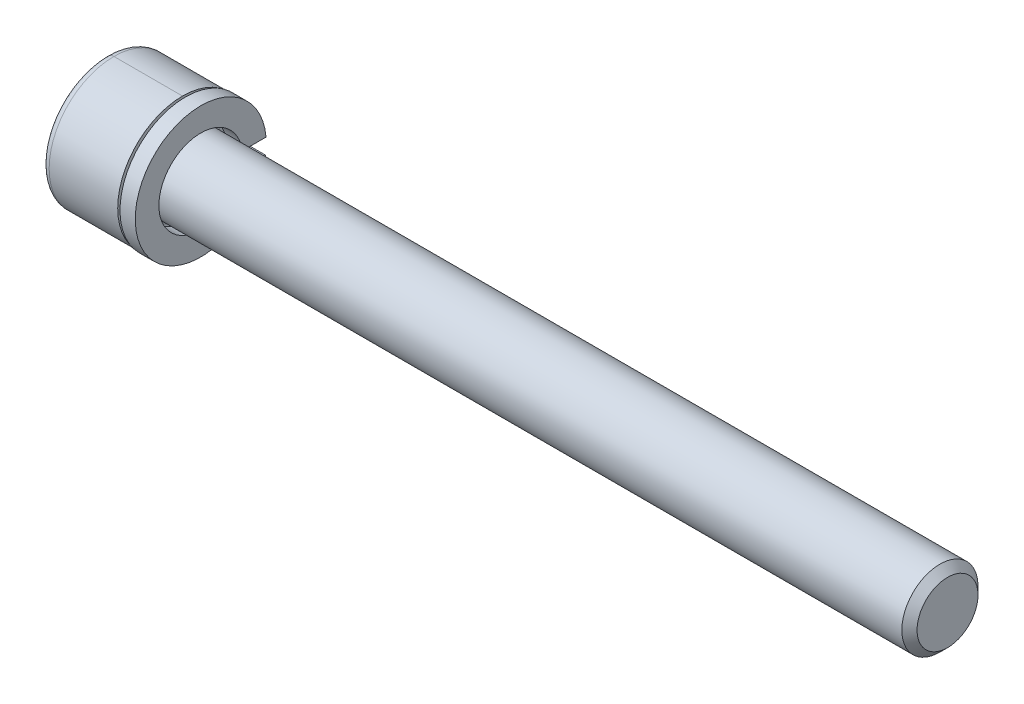
ISO-10303-21;
HEADER;
FILE_DESCRIPTION(('STEP AP214'),'2;1');
FILE_NAME('part.step','',(''),(''),'','','');
FILE_SCHEMA(('AUTOMOTIVE_DESIGN { 1 0 10303 214 1 1 1 1 }'));
ENDSEC;
DATA;
#1=APPLICATION_CONTEXT('core data for automotive mechanical design processes');
#2=APPLICATION_PROTOCOL_DEFINITION('international standard','automotive_design',2000,#1);
#3=PRODUCT_CONTEXT('',#1,'mechanical');
#4=PRODUCT('Part','Part','',(#3));
#5=PRODUCT_RELATED_PRODUCT_CATEGORY('part','',(#4));
#6=PRODUCT_DEFINITION_FORMATION('','',#4);
#7=PRODUCT_DEFINITION_CONTEXT('part definition',#1,'design');
#8=PRODUCT_DEFINITION('design','',#6,#7);
#9=PRODUCT_DEFINITION_SHAPE('','',#8);
#10=(LENGTH_UNIT() NAMED_UNIT(*) SI_UNIT(.MILLI.,.METRE.));
#11=(NAMED_UNIT(*) PLANE_ANGLE_UNIT() SI_UNIT($,.RADIAN.));
#12=(NAMED_UNIT(*) SI_UNIT($,.STERADIAN.) SOLID_ANGLE_UNIT());
#13=UNCERTAINTY_MEASURE_WITH_UNIT(LENGTH_MEASURE(1.E-05),#10,'distance_accuracy_value','');
#14=(GEOMETRIC_REPRESENTATION_CONTEXT(3) GLOBAL_UNCERTAINTY_ASSIGNED_CONTEXT((#13)) GLOBAL_UNIT_ASSIGNED_CONTEXT((#10,
#11,#12)) REPRESENTATION_CONTEXT('',''));
#15=CARTESIAN_POINT('',(0.,0.,0.));
#16=DIRECTION('',(0.,0.,1.));
#17=DIRECTION('',(1.,0.,0.));
#18=AXIS2_PLACEMENT_3D('',#15,#16,#17);
#19=CARTESIAN_POINT('',(1.2,0.,0.));
#20=DIRECTION('',(-1.,0.,0.));
#21=DIRECTION('',(0.,-1.,0.));
#22=AXIS2_PLACEMENT_3D('',#19,#20,#21);
#23=CYLINDRICAL_SURFACE('',#22,4.3);
#24=CARTESIAN_POINT('',(0.2,0.,0.));
#25=DIRECTION('',(1.,0.,0.));
#26=DIRECTION('',(0.,1.,0.));
#27=AXIS2_PLACEMENT_3D('',#24,#25,#26);
#28=CIRCLE('',#27,4.3);
#29=CARTESIAN_POINT('',(0.2,0.374431043820241,-4.28366681634131));
#30=VERTEX_POINT('',#29);
#31=CARTESIAN_POINT('',(0.2,-0.63593269228035,-4.25271555725152));
#32=VERTEX_POINT('',#31);
#33=EDGE_CURVE('P0_E79',#30,#32,#28,.T.);
#34=ORIENTED_EDGE('',*,*,#33,.T.);
#35=DIRECTION('',(-1.,0.,0.));
#36=VECTOR('',#35,1.);
#37=CARTESIAN_POINT('',(1.2,-0.63593269228035,-4.25271555725152));
#38=LINE('',#37,#36);
#39=CARTESIAN_POINT('',(1.2,-0.63593269228035,-4.25271555725152));
#40=VERTEX_POINT('',#39);
#41=EDGE_CURVE('P0_E11',#40,#32,#38,.T.);
#42=ORIENTED_EDGE('',*,*,#41,.F.);
#43=CARTESIAN_POINT('',(1.2,0.,0.));
#44=DIRECTION('',(1.,0.,0.));
#45=DIRECTION('',(0.,1.,0.));
#46=AXIS2_PLACEMENT_3D('',#43,#44,#45);
#47=CIRCLE('',#46,4.3);
#48=CARTESIAN_POINT('',(1.2,0.374431043820241,-4.28366681634131));
#49=VERTEX_POINT('',#48);
#50=EDGE_CURVE('P0_E69',#49,#40,#47,.T.);
#51=ORIENTED_EDGE('',*,*,#50,.F.);
#52=DIRECTION('',(-1.,0.,0.));
#53=VECTOR('',#52,1.);
#54=CARTESIAN_POINT('',(1.2,0.374431043820241,-4.28366681634131));
#55=LINE('',#54,#53);
#56=EDGE_CURVE('P0_E76',#49,#30,#55,.T.);
#57=ORIENTED_EDGE('',*,*,#56,.T.);
#58=EDGE_LOOP('',(#34,#42,#51,#57));
#59=FACE_BOUND('',#58,.T.);
#60=ADVANCED_FACE('P0_F17',(#59),#23,.T.);
#61=CARTESIAN_POINT('',(1.2,-0.63593269228035,-2.67546063527181));
#62=DIRECTION('',(0.,-1.,0.));
#63=DIRECTION('',(1.,0.,0.));
#64=AXIS2_PLACEMENT_3D('',#61,#62,#63);
#65=PLANE('',#64);
#66=DIRECTION('',(0.,0.,1.));
#67=VECTOR('',#66,1.);
#68=CARTESIAN_POINT('',(0.2,-0.63593269228035,-2.67546063527181));
#69=LINE('',#68,#67);
#70=CARTESIAN_POINT('',(0.2,-0.63593269228035,-2.67546063527181));
#71=VERTEX_POINT('',#70);
#72=EDGE_CURVE('P0_E71',#32,#71,#69,.T.);
#73=ORIENTED_EDGE('',*,*,#72,.T.);
#74=DIRECTION('',(-1.,0.,0.));
#75=VECTOR('',#74,1.);
#76=CARTESIAN_POINT('',(1.2,-0.63593269228035,-2.67546063527181));
#77=LINE('',#76,#75);
#78=CARTESIAN_POINT('',(1.2,-0.63593269228035,-2.67546063527181));
#79=VERTEX_POINT('',#78);
#80=EDGE_CURVE('P0_E25',#79,#71,#77,.T.);
#81=ORIENTED_EDGE('',*,*,#80,.F.);
#82=DIRECTION('',(0.,0.,1.));
#83=VECTOR('',#82,1.);
#84=CARTESIAN_POINT('',(1.2,-0.63593269228035,-2.67546063527181));
#85=LINE('',#84,#83);
#86=EDGE_CURVE('P0_E64',#40,#79,#85,.T.);
#87=ORIENTED_EDGE('',*,*,#86,.F.);
#88=ORIENTED_EDGE('',*,*,#41,.T.);
#89=EDGE_LOOP('',(#73,#81,#87,#88));
#90=FACE_BOUND('',#89,.T.);
#91=ADVANCED_FACE('P0_F75',(#90),#65,.F.);
#92=CARTESIAN_POINT('',(1.2,0.,0.));
#93=DIRECTION('',(-1.,0.,0.));
#94=DIRECTION('',(0.,-1.,0.));
#95=AXIS2_PLACEMENT_3D('',#92,#93,#94);
#96=CYLINDRICAL_SURFACE('',#95,2.75);
#97=CARTESIAN_POINT('',(0.2,0.,0.));
#98=DIRECTION('',(-1.,0.,0.));
#99=DIRECTION('',(0.,1.,0.));
#100=AXIS2_PLACEMENT_3D('',#97,#98,#99);
#101=CIRCLE('',#100,2.75);
#102=CARTESIAN_POINT('',(0.2,0.37443104382024,-2.72439009567714));
#103=VERTEX_POINT('',#102);
#104=EDGE_CURVE('P0_E49',#71,#103,#101,.T.);
#105=ORIENTED_EDGE('',*,*,#104,.T.);
#106=DIRECTION('',(-1.,0.,0.));
#107=VECTOR('',#106,1.);
#108=CARTESIAN_POINT('',(1.2,0.374431043820241,-2.72439009567714));
#109=LINE('',#108,#107);
#110=CARTESIAN_POINT('',(1.2,0.374431043820241,-2.72439009567714));
#111=VERTEX_POINT('',#110);
#112=EDGE_CURVE('P0_E73',#111,#103,#109,.T.);
#113=ORIENTED_EDGE('',*,*,#112,.F.);
#114=CARTESIAN_POINT('',(1.2,0.,0.));
#115=DIRECTION('',(-1.,0.,0.));
#116=DIRECTION('',(0.,1.,0.));
#117=AXIS2_PLACEMENT_3D('',#114,#115,#116);
#118=CIRCLE('',#117,2.75);
#119=EDGE_CURVE('P0_E67',#79,#111,#118,.T.);
#120=ORIENTED_EDGE('',*,*,#119,.F.);
#121=ORIENTED_EDGE('',*,*,#80,.T.);
#122=EDGE_LOOP('',(#105,#113,#120,#121));
#123=FACE_BOUND('',#122,.T.);
#124=ADVANCED_FACE('P0_F72',(#123),#96,.F.);
#125=CARTESIAN_POINT('',(1.2,0.374431043820241,-2.72439009567714));
#126=DIRECTION('',(0.,1.,0.));
#127=DIRECTION('',(-1.,0.,0.));
#128=AXIS2_PLACEMENT_3D('',#125,#126,#127);
#129=PLANE('',#128);
#130=DIRECTION('',(0.,0.,-1.));
#131=VECTOR('',#130,1.);
#132=CARTESIAN_POINT('',(0.2,0.374431043820241,-2.72439009567714));
#133=LINE('',#132,#131);
#134=EDGE_CURVE('P0_E57',#103,#30,#133,.T.);
#135=ORIENTED_EDGE('',*,*,#134,.T.);
#136=ORIENTED_EDGE('',*,*,#56,.F.);
#137=DIRECTION('',(0.,0.,-1.));
#138=VECTOR('',#137,1.);
#139=CARTESIAN_POINT('',(1.2,0.374431043820241,-2.72439009567714));
#140=LINE('',#139,#138);
#141=EDGE_CURVE('P0_E31',#111,#49,#140,.T.);
#142=ORIENTED_EDGE('',*,*,#141,.F.);
#143=ORIENTED_EDGE('',*,*,#112,.T.);
#144=EDGE_LOOP('',(#135,#136,#142,#143));
#145=FACE_BOUND('',#144,.T.);
#146=ADVANCED_FACE('P0_F87',(#145),#129,.F.);
#147=CARTESIAN_POINT('',(1.2,0.,0.));
#148=DIRECTION('',(1.,0.,0.));
#149=DIRECTION('',(0.,1.,0.));
#150=AXIS2_PLACEMENT_3D('',#147,#148,#149);
#151=PLANE('',#150);
#152=ORIENTED_EDGE('',*,*,#50,.T.);
#153=ORIENTED_EDGE('',*,*,#86,.T.);
#154=ORIENTED_EDGE('',*,*,#119,.T.);
#155=ORIENTED_EDGE('',*,*,#141,.T.);
#156=EDGE_LOOP('',(#152,#153,#154,#155));
#157=FACE_BOUND('',#156,.T.);
#158=ADVANCED_FACE('P0_F63',(#157),#151,.T.);
#159=CARTESIAN_POINT('',(0.2,0.,0.));
#160=DIRECTION('',(1.,0.,0.));
#161=DIRECTION('',(0.,1.,0.));
#162=AXIS2_PLACEMENT_3D('',#159,#160,#161);
#163=PLANE('',#162);
#164=ORIENTED_EDGE('',*,*,#33,.F.);
#165=ORIENTED_EDGE('',*,*,#134,.F.);
#166=ORIENTED_EDGE('',*,*,#104,.F.);
#167=ORIENTED_EDGE('',*,*,#72,.F.);
#168=EDGE_LOOP('',(#164,#165,#166,#167));
#169=FACE_BOUND('',#168,.T.);
#170=ADVANCED_FACE('P0_F89',(#169),#163,.F.);
#171=CLOSED_SHELL('',(#60,#91,#124,#146,#158,#170));
#172=MANIFOLD_SOLID_BREP('P0_B1',#171);
#173=CARTESIAN_POINT('',(-1.17700185815197,0.,0.));
#174=DIRECTION('',(-1.,0.,0.));
#175=DIRECTION('',(0.,1.,0.));
#176=AXIS2_PLACEMENT_3D('',#173,#174,#175);
#177=CYLINDRICAL_SURFACE('',#176,2.5);
#178=CARTESIAN_POINT('',(49.7,0.,0.));
#179=DIRECTION('',(-1.,0.,0.));
#180=DIRECTION('',(0.,-1.,0.));
#181=AXIS2_PLACEMENT_3D('',#178,#179,#180);
#182=CIRCLE('',#181,2.5);
#183=CARTESIAN_POINT('',(49.7,-2.5,0.));
#184=VERTEX_POINT('',#183);
#185=EDGE_CURVE('P1_E21',#184,#184,#182,.T.);
#186=ORIENTED_EDGE('',*,*,#185,.T.);
#187=EDGE_LOOP('',(#186));
#188=FACE_BOUND('',#187,.T.);
#189=CARTESIAN_POINT('',(0.200000000000003,0.,0.));
#190=DIRECTION('',(-1.,0.,0.));
#191=DIRECTION('',(0.,-1.,0.));
#192=AXIS2_PLACEMENT_3D('',#189,#190,#191);
#193=CIRCLE('',#192,2.5);
#194=CARTESIAN_POINT('',(0.200000000000003,2.5,0.));
#195=VERTEX_POINT('',#194);
#196=CARTESIAN_POINT('',(0.200000000000003,-2.5,0.));
#197=VERTEX_POINT('',#196);
#198=EDGE_CURVE('P1_E31',#195,#197,#193,.T.);
#199=ORIENTED_EDGE('',*,*,#198,.F.);
#200=CARTESIAN_POINT('',(0.200000000000003,0.,0.));
#201=DIRECTION('',(-1.,0.,0.));
#202=DIRECTION('',(0.,-1.,0.));
#203=AXIS2_PLACEMENT_3D('',#200,#201,#202);
#204=CIRCLE('',#203,2.5);
#205=EDGE_CURVE('P1_E252',#197,#195,#204,.T.);
#206=ORIENTED_EDGE('',*,*,#205,.F.);
#207=EDGE_LOOP('',(#199,#206));
#208=FACE_BOUND('',#207,.T.);
#209=ADVANCED_FACE('P1_F17',(#188,#208),#177,.T.);
#210=CARTESIAN_POINT('',(0.200000000000003,0.,0.));
#211=DIRECTION('',(-1.,0.,0.));
#212=DIRECTION('',(0.,1.,0.));
#213=AXIS2_PLACEMENT_3D('',#210,#211,#212);
#214=TOROIDAL_SURFACE('',#213,2.7,0.2);
#215=CARTESIAN_POINT('',(0.2,2.7,0.));
#216=DIRECTION('',(0.,0.,1.));
#217=DIRECTION('',(0.,-1.,0.));
#218=AXIS2_PLACEMENT_3D('',#215,#216,#217);
#219=CIRCLE('',#218,0.2);
#220=CARTESIAN_POINT('',(0.,2.7,0.));
#221=VERTEX_POINT('',#220);
#222=EDGE_CURVE('P1_E254',#221,#195,#219,.T.);
#223=ORIENTED_EDGE('',*,*,#222,.F.);
#224=CARTESIAN_POINT('',(0.,0.,0.));
#225=DIRECTION('',(-1.,0.,0.));
#226=DIRECTION('',(0.,-1.,0.));
#227=AXIS2_PLACEMENT_3D('',#224,#225,#226);
#228=CIRCLE('',#227,2.7);
#229=CARTESIAN_POINT('',(0.,-2.7,0.));
#230=VERTEX_POINT('',#229);
#231=EDGE_CURVE('P1_E250',#230,#221,#228,.T.);
#232=ORIENTED_EDGE('',*,*,#231,.F.);
#233=CARTESIAN_POINT('',(0.200000000000003,-2.7,0.));
#234=DIRECTION('',(0.,0.,-1.));
#235=DIRECTION('',(-1.,0.,0.));
#236=AXIS2_PLACEMENT_3D('',#233,#234,#235);
#237=CIRCLE('',#236,0.2);
#238=EDGE_CURVE('P1_E249',#230,#197,#237,.T.);
#239=ORIENTED_EDGE('',*,*,#238,.T.);
#240=ORIENTED_EDGE('',*,*,#205,.T.);
#241=EDGE_LOOP('',(#223,#232,#239,#240));
#242=FACE_BOUND('',#241,.T.);
#243=ADVANCED_FACE('P1_F264',(#242),#214,.F.);
#244=CARTESIAN_POINT('',(0.200000000000003,0.,0.));
#245=DIRECTION('',(-1.,0.,0.));
#246=DIRECTION('',(0.,1.,0.));
#247=AXIS2_PLACEMENT_3D('',#244,#245,#246);
#248=TOROIDAL_SURFACE('',#247,2.7,0.2);
#249=CARTESIAN_POINT('',(0.,0.,0.));
#250=DIRECTION('',(-1.,0.,0.));
#251=DIRECTION('',(0.,-1.,0.));
#252=AXIS2_PLACEMENT_3D('',#249,#250,#251);
#253=CIRCLE('',#252,2.7);
#254=EDGE_CURVE('P1_E242',#221,#230,#253,.T.);
#255=ORIENTED_EDGE('',*,*,#254,.F.);
#256=ORIENTED_EDGE('',*,*,#222,.T.);
#257=ORIENTED_EDGE('',*,*,#198,.T.);
#258=ORIENTED_EDGE('',*,*,#238,.F.);
#259=EDGE_LOOP('',(#255,#256,#257,#258));
#260=FACE_BOUND('',#259,.T.);
#261=ADVANCED_FACE('P1_F267',(#260),#248,.F.);
#262=CARTESIAN_POINT('',(0.,4.25,0.));
#263=DIRECTION('',(-1.,0.,0.));
#264=DIRECTION('',(0.,1.,0.));
#265=AXIS2_PLACEMENT_3D('',#262,#263,#264);
#266=PLANE('',#265);
#267=CARTESIAN_POINT('',(0.,0.,0.));
#268=DIRECTION('',(-1.,0.,0.));
#269=DIRECTION('',(0.,-1.,0.));
#270=AXIS2_PLACEMENT_3D('',#267,#268,#269);
#271=CIRCLE('',#270,4.25);
#272=CARTESIAN_POINT('',(0.,-4.25,0.));
#273=VERTEX_POINT('',#272);
#274=CARTESIAN_POINT('',(0.,4.25,0.));
#275=VERTEX_POINT('',#274);
#276=EDGE_CURVE('P1_E236',#273,#275,#271,.T.);
#277=ORIENTED_EDGE('',*,*,#276,.F.);
#278=CARTESIAN_POINT('',(0.,0.,0.));
#279=DIRECTION('',(-1.,0.,0.));
#280=DIRECTION('',(0.,-1.,0.));
#281=AXIS2_PLACEMENT_3D('',#278,#279,#280);
#282=CIRCLE('',#281,4.25);
#283=EDGE_CURVE('P1_E228',#275,#273,#282,.T.);
#284=ORIENTED_EDGE('',*,*,#283,.F.);
#285=EDGE_LOOP('',(#277,#284));
#286=FACE_BOUND('',#285,.T.);
#287=ORIENTED_EDGE('',*,*,#231,.T.);
#288=ORIENTED_EDGE('',*,*,#254,.T.);
#289=EDGE_LOOP('',(#287,#288));
#290=FACE_BOUND('',#289,.T.);
#291=ADVANCED_FACE('P1_F271',(#286,#290),#266,.F.);
#292=CARTESIAN_POINT('',(-1.17700185815197,0.,0.));
#293=DIRECTION('',(-1.,0.,0.));
#294=DIRECTION('',(0.,1.,0.));
#295=AXIS2_PLACEMENT_3D('',#292,#293,#294);
#296=CYLINDRICAL_SURFACE('',#295,4.25);
#297=ORIENTED_EDGE('',*,*,#276,.T.);
#298=DIRECTION('',(-1.,0.,0.));
#299=VECTOR('',#298,1.);
#300=CARTESIAN_POINT('',(-1.17700185815198,4.25,0.));
#301=LINE('',#300,#299);
#302=CARTESIAN_POINT('',(-4.5,4.25,0.));
#303=VERTEX_POINT('',#302);
#304=EDGE_CURVE('P1_E233',#303,#275,#301,.F.);
#305=ORIENTED_EDGE('',*,*,#304,.F.);
#306=CARTESIAN_POINT('',(-4.5,0.,0.));
#307=DIRECTION('',(-1.,0.,0.));
#308=DIRECTION('',(0.,-1.,0.));
#309=AXIS2_PLACEMENT_3D('',#306,#307,#308);
#310=CIRCLE('',#309,4.25);
#311=CARTESIAN_POINT('',(-4.5,-4.25,0.));
#312=VERTEX_POINT('',#311);
#313=EDGE_CURVE('P1_E225',#312,#303,#310,.T.);
#314=ORIENTED_EDGE('',*,*,#313,.F.);
#315=DIRECTION('',(-1.,0.,0.));
#316=VECTOR('',#315,1.);
#317=CARTESIAN_POINT('',(-1.17700185815197,-4.25,0.));
#318=LINE('',#317,#316);
#319=EDGE_CURVE('P1_E223',#312,#273,#318,.F.);
#320=ORIENTED_EDGE('',*,*,#319,.T.);
#321=EDGE_LOOP('',(#297,#305,#314,#320));
#322=FACE_BOUND('',#321,.T.);
#323=ADVANCED_FACE('P1_F272',(#322),#296,.T.);
#324=CARTESIAN_POINT('',(-1.17700185815197,0.,0.));
#325=DIRECTION('',(-1.,0.,0.));
#326=DIRECTION('',(0.,1.,0.));
#327=AXIS2_PLACEMENT_3D('',#324,#325,#326);
#328=CYLINDRICAL_SURFACE('',#327,4.25);
#329=ORIENTED_EDGE('',*,*,#304,.T.);
#330=ORIENTED_EDGE('',*,*,#283,.T.);
#331=ORIENTED_EDGE('',*,*,#319,.F.);
#332=CARTESIAN_POINT('',(-4.5,0.,0.));
#333=DIRECTION('',(-1.,0.,0.));
#334=DIRECTION('',(0.,-1.,0.));
#335=AXIS2_PLACEMENT_3D('',#332,#333,#334);
#336=CIRCLE('',#335,4.25);
#337=EDGE_CURVE('P1_E214',#303,#312,#336,.T.);
#338=ORIENTED_EDGE('',*,*,#337,.F.);
#339=EDGE_LOOP('',(#329,#330,#331,#338));
#340=FACE_BOUND('',#339,.T.);
#341=ADVANCED_FACE('P1_F282',(#340),#328,.T.);
#342=CARTESIAN_POINT('',(-4.5,0.,0.));
#343=DIRECTION('',(-1.,0.,0.));
#344=DIRECTION('',(0.,1.,0.));
#345=AXIS2_PLACEMENT_3D('',#342,#343,#344);
#346=TOROIDAL_SURFACE('',#345,3.75,0.5);
#347=ORIENTED_EDGE('',*,*,#313,.T.);
#348=CARTESIAN_POINT('',(-4.5,3.75,0.));
#349=DIRECTION('',(0.,0.,1.));
#350=DIRECTION('',(0.,-1.,0.));
#351=AXIS2_PLACEMENT_3D('',#348,#349,#350);
#352=CIRCLE('',#351,0.5);
#353=CARTESIAN_POINT('',(-5.,3.75,0.));
#354=VERTEX_POINT('',#353);
#355=EDGE_CURVE('P1_E217',#354,#303,#352,.F.);
#356=ORIENTED_EDGE('',*,*,#355,.F.);
#357=CARTESIAN_POINT('',(-5.,0.,0.));
#358=DIRECTION('',(-1.,0.,0.));
#359=DIRECTION('',(0.,-1.,0.));
#360=AXIS2_PLACEMENT_3D('',#357,#358,#359);
#361=CIRCLE('',#360,3.75);
#362=CARTESIAN_POINT('',(-5.,-3.75,0.));
#363=VERTEX_POINT('',#362);
#364=EDGE_CURVE('P1_E209',#363,#354,#361,.T.);
#365=ORIENTED_EDGE('',*,*,#364,.F.);
#366=CARTESIAN_POINT('',(-4.5,-3.75,0.));
#367=DIRECTION('',(0.,0.,-1.));
#368=DIRECTION('',(-1.,0.,0.));
#369=AXIS2_PLACEMENT_3D('',#366,#367,#368);
#370=CIRCLE('',#369,0.5);
#371=EDGE_CURVE('P1_E211',#363,#312,#370,.F.);
#372=ORIENTED_EDGE('',*,*,#371,.T.);
#373=EDGE_LOOP('',(#347,#356,#365,#372));
#374=FACE_BOUND('',#373,.T.);
#375=ADVANCED_FACE('P1_F368',(#374),#346,.T.);
#376=CARTESIAN_POINT('',(-4.5,0.,0.));
#377=DIRECTION('',(-1.,0.,0.));
#378=DIRECTION('',(0.,1.,0.));
#379=AXIS2_PLACEMENT_3D('',#376,#377,#378);
#380=TOROIDAL_SURFACE('',#379,3.75,0.5);
#381=ORIENTED_EDGE('',*,*,#355,.T.);
#382=ORIENTED_EDGE('',*,*,#337,.T.);
#383=ORIENTED_EDGE('',*,*,#371,.F.);
#384=CARTESIAN_POINT('',(-5.,0.,0.));
#385=DIRECTION('',(-1.,0.,0.));
#386=DIRECTION('',(0.,-1.,0.));
#387=AXIS2_PLACEMENT_3D('',#384,#385,#386);
#388=CIRCLE('',#387,3.75);
#389=EDGE_CURVE('P1_E200',#354,#363,#388,.T.);
#390=ORIENTED_EDGE('',*,*,#389,.F.);
#391=EDGE_LOOP('',(#381,#382,#383,#390));
#392=FACE_BOUND('',#391,.T.);
#393=ADVANCED_FACE('P1_F362',(#392),#380,.T.);
#394=CARTESIAN_POINT('',(-5.,2.2915,0.));
#395=DIRECTION('',(1.,0.,0.));
#396=DIRECTION('',(0.,-1.,0.));
#397=AXIS2_PLACEMENT_3D('',#394,#395,#396);
#398=PLANE('',#397);
#399=DIRECTION('',(0.,0.5,0.866025403784438));
#400=VECTOR('',#399,1.);
#401=CARTESIAN_POINT('',(-5.,-2.2915,0.));
#402=LINE('',#401,#400);
#403=CARTESIAN_POINT('',(-5.,-2.2915,0.));
#404=VERTEX_POINT('',#403);
#405=CARTESIAN_POINT('',(-5.,-1.14575,1.98449721277204));
#406=VERTEX_POINT('',#405);
#407=EDGE_CURVE('P1_E163',#404,#406,#402,.T.);
#408=ORIENTED_EDGE('',*,*,#407,.F.);
#409=DIRECTION('',(0.,-0.5,0.866025403784438));
#410=VECTOR('',#409,1.);
#411=CARTESIAN_POINT('',(-5.,-1.14575,-1.98449721277204));
#412=LINE('',#411,#410);
#413=CARTESIAN_POINT('',(-5.,-1.14575,-1.98449721277204));
#414=VERTEX_POINT('',#413);
#415=EDGE_CURVE('P1_E154',#414,#404,#412,.T.);
#416=ORIENTED_EDGE('',*,*,#415,.F.);
#417=DIRECTION('',(0.,-1.,0.));
#418=VECTOR('',#417,1.);
#419=CARTESIAN_POINT('',(-5.,1.14575,-1.98449721277205));
#420=LINE('',#419,#418);
#421=CARTESIAN_POINT('',(-5.,1.14575,-1.98449721277204));
#422=VERTEX_POINT('',#421);
#423=EDGE_CURVE('P1_E178',#422,#414,#420,.T.);
#424=ORIENTED_EDGE('',*,*,#423,.F.);
#425=DIRECTION('',(0.,-0.5,-0.866025403784439));
#426=VECTOR('',#425,1.);
#427=CARTESIAN_POINT('',(-5.,2.2915,0.));
#428=LINE('',#427,#426);
#429=CARTESIAN_POINT('',(-5.,2.2915,0.));
#430=VERTEX_POINT('',#429);
#431=EDGE_CURVE('P1_E183',#430,#422,#428,.T.);
#432=ORIENTED_EDGE('',*,*,#431,.F.);
#433=DIRECTION('',(0.,0.5,-0.866025403784439));
#434=VECTOR('',#433,1.);
#435=CARTESIAN_POINT('',(-5.,1.14575,1.98449721277204));
#436=LINE('',#435,#434);
#437=CARTESIAN_POINT('',(-5.,1.14575,1.98449721277204));
#438=VERTEX_POINT('',#437);
#439=EDGE_CURVE('P1_E156',#438,#430,#436,.T.);
#440=ORIENTED_EDGE('',*,*,#439,.F.);
#441=DIRECTION('',(0.,1.,0.));
#442=VECTOR('',#441,1.);
#443=CARTESIAN_POINT('',(-5.,-1.14575,1.98449721277204));
#444=LINE('',#443,#442);
#445=EDGE_CURVE('P1_E168',#406,#438,#444,.T.);
#446=ORIENTED_EDGE('',*,*,#445,.F.);
#447=EDGE_LOOP('',(#408,#416,#424,#432,#440,#446));
#448=FACE_BOUND('',#447,.T.);
#449=ORIENTED_EDGE('',*,*,#364,.T.);
#450=ORIENTED_EDGE('',*,*,#389,.T.);
#451=EDGE_LOOP('',(#449,#450));
#452=FACE_BOUND('',#451,.T.);
#453=ADVANCED_FACE('P1_F359',(#448,#452),#398,.F.);
#454=CARTESIAN_POINT('',(-2.5,2.2915,0.));
#455=DIRECTION('',(0.,0.866025403784439,-0.5));
#456=DIRECTION('',(0.,-0.5,-0.866025403784439));
#457=AXIS2_PLACEMENT_3D('',#454,#455,#456);
#458=PLANE('',#457);
#459=ORIENTED_EDGE('',*,*,#431,.T.);
#460=DIRECTION('',(-1.,0.,0.));
#461=VECTOR('',#460,1.);
#462=CARTESIAN_POINT('',(-2.5,1.14575,-1.98449721277205));
#463=LINE('',#462,#461);
#464=CARTESIAN_POINT('',(-2.5,1.14575,-1.98449721277205));
#465=VERTEX_POINT('',#464);
#466=EDGE_CURVE('P1_E190',#465,#422,#463,.T.);
#467=ORIENTED_EDGE('',*,*,#466,.F.);
#468=DIRECTION('',(0.,-0.5,-0.866025403784439));
#469=VECTOR('',#468,1.);
#470=CARTESIAN_POINT('',(-2.5,2.2915,0.));
#471=LINE('',#470,#469);
#472=CARTESIAN_POINT('',(-2.5,2.2915,0.));
#473=VERTEX_POINT('',#472);
#474=EDGE_CURVE('P1_E164',#473,#465,#471,.T.);
#475=ORIENTED_EDGE('',*,*,#474,.F.);
#476=DIRECTION('',(-1.,0.,0.));
#477=VECTOR('',#476,1.);
#478=CARTESIAN_POINT('',(-2.5,2.2915,0.));
#479=LINE('',#478,#477);
#480=EDGE_CURVE('P1_E177',#473,#430,#479,.T.);
#481=ORIENTED_EDGE('',*,*,#480,.T.);
#482=EDGE_LOOP('',(#459,#467,#475,#481));
#483=FACE_BOUND('',#482,.T.);
#484=ADVANCED_FACE('P1_F353',(#483),#458,.F.);
#485=CARTESIAN_POINT('',(-2.5,-1.14575,1.98449721277204));
#486=DIRECTION('',(0.,0.,1.));
#487=DIRECTION('',(0.,1.,0.));
#488=AXIS2_PLACEMENT_3D('',#485,#486,#487);
#489=PLANE('',#488);
#490=ORIENTED_EDGE('',*,*,#445,.T.);
#491=DIRECTION('',(-1.,0.,0.));
#492=VECTOR('',#491,1.);
#493=CARTESIAN_POINT('',(-2.5,1.14575,1.98449721277204));
#494=LINE('',#493,#492);
#495=CARTESIAN_POINT('',(-2.5,1.14575,1.98449721277204));
#496=VERTEX_POINT('',#495);
#497=EDGE_CURVE('P1_E173',#496,#438,#494,.T.);
#498=ORIENTED_EDGE('',*,*,#497,.F.);
#499=DIRECTION('',(0.,1.,0.));
#500=VECTOR('',#499,1.);
#501=CARTESIAN_POINT('',(-2.5,-1.14575,1.98449721277204));
#502=LINE('',#501,#500);
#503=CARTESIAN_POINT('',(-2.5,-1.14575,1.98449721277204));
#504=VERTEX_POINT('',#503);
#505=EDGE_CURVE('P1_E157',#504,#496,#502,.T.);
#506=ORIENTED_EDGE('',*,*,#505,.F.);
#507=DIRECTION('',(-1.,0.,0.));
#508=VECTOR('',#507,1.);
#509=CARTESIAN_POINT('',(-2.5,-1.14575,1.98449721277204));
#510=LINE('',#509,#508);
#511=EDGE_CURVE('P1_E167',#504,#406,#510,.T.);
#512=ORIENTED_EDGE('',*,*,#511,.T.);
#513=EDGE_LOOP('',(#490,#498,#506,#512));
#514=FACE_BOUND('',#513,.T.);
#515=ADVANCED_FACE('P1_F349',(#514),#489,.F.);
#516=CARTESIAN_POINT('',(-2.5,-1.14575,-1.98449721277204));
#517=DIRECTION('',(0.,-0.866025403784438,-0.5));
#518=DIRECTION('',(0.,-0.5,0.866025403784438));
#519=AXIS2_PLACEMENT_3D('',#516,#517,#518);
#520=PLANE('',#519);
#521=ORIENTED_EDGE('',*,*,#415,.T.);
#522=DIRECTION('',(-1.,0.,0.));
#523=VECTOR('',#522,1.);
#524=CARTESIAN_POINT('',(-2.5,-2.2915,0.));
#525=LINE('',#524,#523);
#526=CARTESIAN_POINT('',(-2.5,-2.2915,0.));
#527=VERTEX_POINT('',#526);
#528=EDGE_CURVE('P1_E159',#527,#404,#525,.T.);
#529=ORIENTED_EDGE('',*,*,#528,.F.);
#530=DIRECTION('',(0.,-0.5,0.866025403784438));
#531=VECTOR('',#530,1.);
#532=CARTESIAN_POINT('',(-2.5,-1.14575,-1.98449721277204));
#533=LINE('',#532,#531);
#534=CARTESIAN_POINT('',(-2.5,-1.14575,-1.98449721277204));
#535=VERTEX_POINT('',#534);
#536=EDGE_CURVE('P1_E147',#535,#527,#533,.T.);
#537=ORIENTED_EDGE('',*,*,#536,.F.);
#538=DIRECTION('',(-1.,0.,0.));
#539=VECTOR('',#538,1.);
#540=CARTESIAN_POINT('',(-2.5,-1.14575,-1.98449721277204));
#541=LINE('',#540,#539);
#542=EDGE_CURVE('P1_E151',#535,#414,#541,.T.);
#543=ORIENTED_EDGE('',*,*,#542,.T.);
#544=EDGE_LOOP('',(#521,#529,#537,#543));
#545=FACE_BOUND('',#544,.T.);
#546=ADVANCED_FACE('P1_F350',(#545),#520,.F.);
#547=CARTESIAN_POINT('',(-2.5,1.14575,1.98449721277204));
#548=DIRECTION('',(0.,0.866025403784439,0.5));
#549=DIRECTION('',(0.,0.5,-0.866025403784439));
#550=AXIS2_PLACEMENT_3D('',#547,#548,#549);
#551=PLANE('',#550);
#552=ORIENTED_EDGE('',*,*,#439,.T.);
#553=ORIENTED_EDGE('',*,*,#480,.F.);
#554=DIRECTION('',(0.,0.5,-0.866025403784439));
#555=VECTOR('',#554,1.);
#556=CARTESIAN_POINT('',(-2.5,1.14575,1.98449721277204));
#557=LINE('',#556,#555);
#558=EDGE_CURVE('P1_E148',#496,#473,#557,.T.);
#559=ORIENTED_EDGE('',*,*,#558,.F.);
#560=ORIENTED_EDGE('',*,*,#497,.T.);
#561=EDGE_LOOP('',(#552,#553,#559,#560));
#562=FACE_BOUND('',#561,.T.);
#563=ADVANCED_FACE('P1_F345',(#562),#551,.F.);
#564=CARTESIAN_POINT('',(-2.5,1.14575,-1.98449721277205));
#565=DIRECTION('',(0.,0.,-1.));
#566=DIRECTION('',(0.,-1.,0.));
#567=AXIS2_PLACEMENT_3D('',#564,#565,#566);
#568=PLANE('',#567);
#569=ORIENTED_EDGE('',*,*,#423,.T.);
#570=ORIENTED_EDGE('',*,*,#542,.F.);
#571=DIRECTION('',(0.,-1.,0.));
#572=VECTOR('',#571,1.);
#573=CARTESIAN_POINT('',(-2.5,1.14575,-1.98449721277205));
#574=LINE('',#573,#572);
#575=EDGE_CURVE('P1_E128',#465,#535,#574,.T.);
#576=ORIENTED_EDGE('',*,*,#575,.F.);
#577=ORIENTED_EDGE('',*,*,#466,.T.);
#578=EDGE_LOOP('',(#569,#570,#576,#577));
#579=FACE_BOUND('',#578,.T.);
#580=ADVANCED_FACE('P1_F339',(#579),#568,.F.);
#581=CARTESIAN_POINT('',(-2.5,-2.2915,0.));
#582=DIRECTION('',(0.,-0.866025403784438,0.5));
#583=DIRECTION('',(0.,0.5,0.866025403784438));
#584=AXIS2_PLACEMENT_3D('',#581,#582,#583);
#585=PLANE('',#584);
#586=ORIENTED_EDGE('',*,*,#407,.T.);
#587=ORIENTED_EDGE('',*,*,#511,.F.);
#588=DIRECTION('',(0.,0.5,0.866025403784438));
#589=VECTOR('',#588,1.);
#590=CARTESIAN_POINT('',(-2.5,-2.2915,0.));
#591=LINE('',#590,#589);
#592=EDGE_CURVE('P1_E120',#527,#504,#591,.T.);
#593=ORIENTED_EDGE('',*,*,#592,.F.);
#594=ORIENTED_EDGE('',*,*,#528,.T.);
#595=EDGE_LOOP('',(#586,#587,#593,#594));
#596=FACE_BOUND('',#595,.T.);
#597=ADVANCED_FACE('P1_F331',(#596),#585,.F.);
#598=CARTESIAN_POINT('',(-2.5,0.,0.));
#599=DIRECTION('',(-1.,0.,0.));
#600=DIRECTION('',(0.,1.,0.));
#601=AXIS2_PLACEMENT_3D('',#598,#599,#600);
#602=PLANE('',#601);
#603=ORIENTED_EDGE('',*,*,#474,.T.);
#604=CARTESIAN_POINT('',(-2.5,0.,0.));
#605=DIRECTION('',(-1.,0.,0.));
#606=DIRECTION('',(0.,-1.,0.));
#607=AXIS2_PLACEMENT_3D('',#604,#605,#606);
#608=CIRCLE('',#607,2.2915);
#609=EDGE_CURVE('P1_E121',#473,#465,#608,.T.);
#610=ORIENTED_EDGE('',*,*,#609,.F.);
#611=EDGE_LOOP('',(#603,#610));
#612=FACE_BOUND('',#611,.T.);
#613=ADVANCED_FACE('P1_F329',(#612),#602,.F.);
#614=CARTESIAN_POINT('',(-2.5,0.,0.));
#615=DIRECTION('',(-1.,0.,0.));
#616=DIRECTION('',(0.,1.,0.));
#617=AXIS2_PLACEMENT_3D('',#614,#615,#616);
#618=PLANE('',#617);
#619=ORIENTED_EDGE('',*,*,#505,.T.);
#620=CARTESIAN_POINT('',(-2.5,0.,0.));
#621=DIRECTION('',(-1.,0.,0.));
#622=DIRECTION('',(0.,-1.,0.));
#623=AXIS2_PLACEMENT_3D('',#620,#621,#622);
#624=CIRCLE('',#623,2.2915);
#625=EDGE_CURVE('P1_E134',#504,#496,#624,.T.);
#626=ORIENTED_EDGE('',*,*,#625,.F.);
#627=EDGE_LOOP('',(#619,#626));
#628=FACE_BOUND('',#627,.T.);
#629=ADVANCED_FACE('P1_F330',(#628),#618,.F.);
#630=CARTESIAN_POINT('',(-2.5,0.,0.));
#631=DIRECTION('',(-1.,0.,0.));
#632=DIRECTION('',(0.,1.,0.));
#633=AXIS2_PLACEMENT_3D('',#630,#631,#632);
#634=PLANE('',#633);
#635=ORIENTED_EDGE('',*,*,#536,.T.);
#636=CARTESIAN_POINT('',(-2.5,0.,0.));
#637=DIRECTION('',(-1.,0.,0.));
#638=DIRECTION('',(0.,-1.,0.));
#639=AXIS2_PLACEMENT_3D('',#636,#637,#638);
#640=CIRCLE('',#639,2.2915);
#641=EDGE_CURVE('P1_E98',#535,#527,#640,.T.);
#642=ORIENTED_EDGE('',*,*,#641,.F.);
#643=EDGE_LOOP('',(#635,#642));
#644=FACE_BOUND('',#643,.T.);
#645=ADVANCED_FACE('P1_F323',(#644),#634,.F.);
#646=CARTESIAN_POINT('',(-2.5,0.,0.));
#647=DIRECTION('',(-1.,0.,0.));
#648=DIRECTION('',(0.,1.,0.));
#649=AXIS2_PLACEMENT_3D('',#646,#647,#648);
#650=PLANE('',#649);
#651=ORIENTED_EDGE('',*,*,#558,.T.);
#652=CARTESIAN_POINT('',(-2.5,0.,0.));
#653=DIRECTION('',(-1.,0.,0.));
#654=DIRECTION('',(0.,-1.,0.));
#655=AXIS2_PLACEMENT_3D('',#652,#653,#654);
#656=CIRCLE('',#655,2.2915);
#657=EDGE_CURVE('P1_E117',#496,#473,#656,.T.);
#658=ORIENTED_EDGE('',*,*,#657,.F.);
#659=EDGE_LOOP('',(#651,#658));
#660=FACE_BOUND('',#659,.T.);
#661=ADVANCED_FACE('P1_F317',(#660),#650,.F.);
#662=CARTESIAN_POINT('',(-2.5,0.,0.));
#663=DIRECTION('',(-1.,0.,0.));
#664=DIRECTION('',(0.,1.,0.));
#665=AXIS2_PLACEMENT_3D('',#662,#663,#664);
#666=PLANE('',#665);
#667=ORIENTED_EDGE('',*,*,#575,.T.);
#668=CARTESIAN_POINT('',(-2.5,0.,0.));
#669=DIRECTION('',(-1.,0.,0.));
#670=DIRECTION('',(0.,-1.,0.));
#671=AXIS2_PLACEMENT_3D('',#668,#669,#670);
#672=CIRCLE('',#671,2.2915);
#673=EDGE_CURVE('P1_E129',#465,#535,#672,.T.);
#674=ORIENTED_EDGE('',*,*,#673,.F.);
#675=EDGE_LOOP('',(#667,#674));
#676=FACE_BOUND('',#675,.T.);
#677=ADVANCED_FACE('P1_F312',(#676),#666,.F.);
#678=CARTESIAN_POINT('',(-2.5,0.,0.));
#679=DIRECTION('',(-1.,0.,0.));
#680=DIRECTION('',(0.,1.,0.));
#681=AXIS2_PLACEMENT_3D('',#678,#679,#680);
#682=PLANE('',#681);
#683=ORIENTED_EDGE('',*,*,#592,.T.);
#684=CARTESIAN_POINT('',(-2.5,0.,0.));
#685=DIRECTION('',(-1.,0.,0.));
#686=DIRECTION('',(0.,-1.,0.));
#687=AXIS2_PLACEMENT_3D('',#684,#685,#686);
#688=CIRCLE('',#687,2.2915);
#689=EDGE_CURVE('P1_E114',#527,#504,#688,.T.);
#690=ORIENTED_EDGE('',*,*,#689,.F.);
#691=EDGE_LOOP('',(#683,#690));
#692=FACE_BOUND('',#691,.T.);
#693=ADVANCED_FACE('P1_F315',(#692),#682,.F.);
#694=CARTESIAN_POINT('',(-2.5,0.,0.));
#695=DIRECTION('',(-1.,0.,0.));
#696=DIRECTION('',(0.,1.,0.));
#697=AXIS2_PLACEMENT_3D('',#694,#695,#696);
#698=CONICAL_SURFACE('',#697,2.2915,1.0471975511966);
#699=DIRECTION('',(-0.5,-0.86602540378444,0.));
#700=VECTOR('',#699,1.);
#701=CARTESIAN_POINT('',(-2.5,-2.2915,0.));
#702=LINE('',#701,#700);
#703=CARTESIAN_POINT('',(-1.17700185815197,0.,0.));
#704=VERTEX_POINT('',#703);
#705=EDGE_CURVE('P1_E102',#527,#704,#702,.F.);
#706=ORIENTED_EDGE('',*,*,#705,.T.);
#707=DIRECTION('',(-0.5,0.86602540378444,0.));
#708=VECTOR('',#707,1.);
#709=CARTESIAN_POINT('',(-2.5,2.2915,0.));
#710=LINE('',#709,#708);
#711=EDGE_CURVE('P1_E110',#473,#704,#710,.F.);
#712=ORIENTED_EDGE('',*,*,#711,.F.);
#713=ORIENTED_EDGE('',*,*,#609,.T.);
#714=ORIENTED_EDGE('',*,*,#673,.T.);
#715=ORIENTED_EDGE('',*,*,#641,.T.);
#716=EDGE_LOOP('',(#706,#712,#713,#714,#715));
#717=FACE_BOUND('',#716,.T.);
#718=ADVANCED_FACE('P1_F106',(#717),#698,.F.);
#719=CARTESIAN_POINT('',(-2.5,0.,0.));
#720=DIRECTION('',(-1.,0.,0.));
#721=DIRECTION('',(0.,1.,0.));
#722=AXIS2_PLACEMENT_3D('',#719,#720,#721);
#723=CONICAL_SURFACE('',#722,2.2915,1.0471975511966);
#724=ORIENTED_EDGE('',*,*,#711,.T.);
#725=ORIENTED_EDGE('',*,*,#705,.F.);
#726=ORIENTED_EDGE('',*,*,#689,.T.);
#727=ORIENTED_EDGE('',*,*,#625,.T.);
#728=ORIENTED_EDGE('',*,*,#657,.T.);
#729=EDGE_LOOP('',(#724,#725,#726,#727,#728));
#730=FACE_BOUND('',#729,.T.);
#731=ADVANCED_FACE('P1_F113',(#730),#723,.F.);
#732=CARTESIAN_POINT('',(50.2,0.,0.));
#733=DIRECTION('',(-1.,0.,0.));
#734=DIRECTION('',(0.,0.,1.));
#735=AXIS2_PLACEMENT_3D('',#732,#733,#734);
#736=PLANE('',#735);
#737=CARTESIAN_POINT('',(50.2,0.,0.));
#738=DIRECTION('',(-1.,0.,0.));
#739=DIRECTION('',(0.,0.,1.));
#740=AXIS2_PLACEMENT_3D('',#737,#738,#739);
#741=CIRCLE('',#740,2.);
#742=CARTESIAN_POINT('',(50.2,0.,2.));
#743=VERTEX_POINT('',#742);
#744=EDGE_CURVE('P1_E11',#743,#743,#741,.F.);
#745=ORIENTED_EDGE('',*,*,#744,.T.);
#746=EDGE_LOOP('',(#745));
#747=FACE_BOUND('',#746,.T.);
#748=ADVANCED_FACE('P1_F19',(#747),#736,.F.);
#749=CARTESIAN_POINT('',(49.7,0.,0.));
#750=DIRECTION('',(-1.,0.,0.));
#751=DIRECTION('',(0.,-1.,0.));
#752=AXIS2_PLACEMENT_3D('',#749,#750,#751);
#753=CONICAL_SURFACE('',#752,2.5,0.785398163397448);
#754=ORIENTED_EDGE('',*,*,#744,.F.);
#755=EDGE_LOOP('',(#754));
#756=FACE_BOUND('',#755,.T.);
#757=ORIENTED_EDGE('',*,*,#185,.F.);
#758=EDGE_LOOP('',(#757));
#759=FACE_BOUND('',#758,.T.);
#760=ADVANCED_FACE('P1_F297',(#756,#759),#753,.T.);
#761=CLOSED_SHELL('',(#209,#243,#261,#291,#323,#341,#375,#393,#453,#484,#515,#546,#563,#580,
#597,#613,#629,#645,#661,#677,#693,#718,#731,#748,#760));
#762=MANIFOLD_SOLID_BREP('P1_B1',#761);
#763=ADVANCED_BREP_SHAPE_REPRESENTATION('',(#18,#172,#762),#14);
#764=SHAPE_DEFINITION_REPRESENTATION(#9,#763);
ENDSEC;
END-ISO-10303-21;
